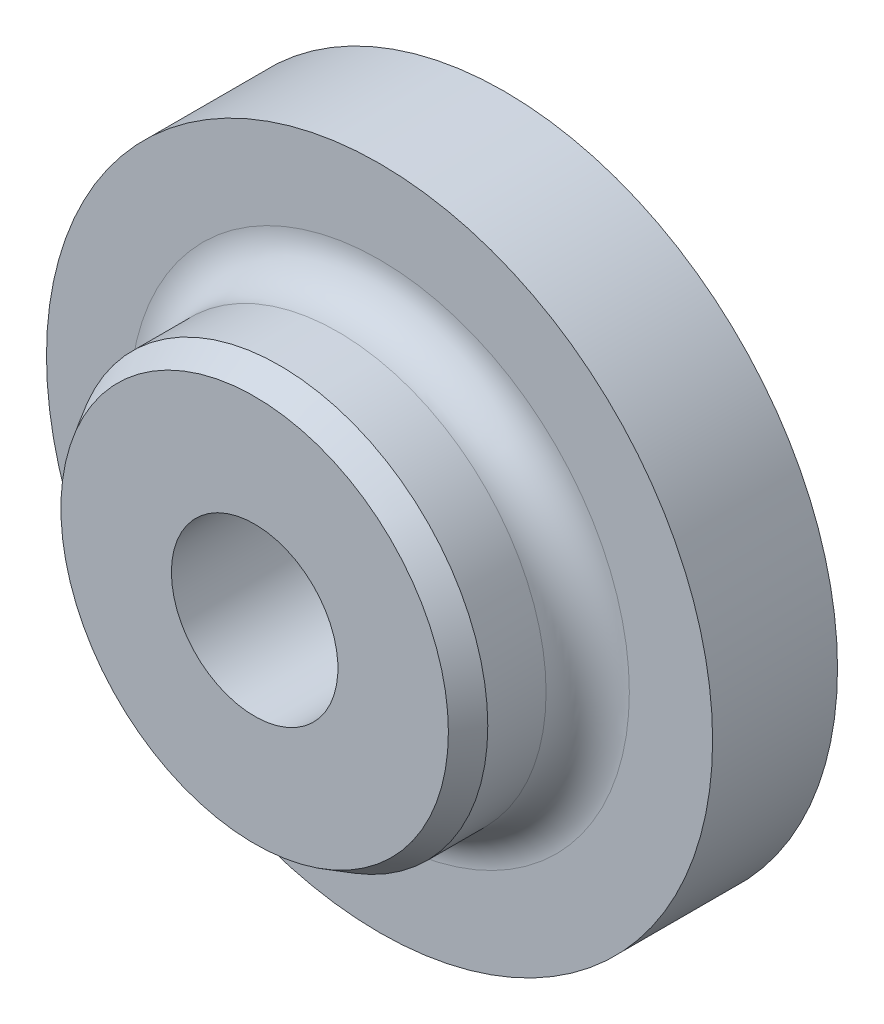
ISO-10303-21;
HEADER;
FILE_DESCRIPTION(('STEP AP214'),'2;1');
FILE_NAME('part.step','',(''),(''),'','','');
FILE_SCHEMA(('AUTOMOTIVE_DESIGN { 1 0 10303 214 1 1 1 1 }'));
ENDSEC;
DATA;
#1=APPLICATION_CONTEXT('core data for automotive mechanical design processes');
#2=APPLICATION_PROTOCOL_DEFINITION('international standard','automotive_design',2000,#1);
#3=PRODUCT_CONTEXT('',#1,'mechanical');
#4=PRODUCT('Part','Part','',(#3));
#5=PRODUCT_RELATED_PRODUCT_CATEGORY('part','',(#4));
#6=PRODUCT_DEFINITION_FORMATION('','',#4);
#7=PRODUCT_DEFINITION_CONTEXT('part definition',#1,'design');
#8=PRODUCT_DEFINITION('design','',#6,#7);
#9=PRODUCT_DEFINITION_SHAPE('','',#8);
#10=(LENGTH_UNIT() NAMED_UNIT(*) SI_UNIT(.MILLI.,.METRE.));
#11=(NAMED_UNIT(*) PLANE_ANGLE_UNIT() SI_UNIT($,.RADIAN.));
#12=(NAMED_UNIT(*) SI_UNIT($,.STERADIAN.) SOLID_ANGLE_UNIT());
#13=UNCERTAINTY_MEASURE_WITH_UNIT(LENGTH_MEASURE(1.E-05),#10,'distance_accuracy_value','');
#14=(GEOMETRIC_REPRESENTATION_CONTEXT(3) GLOBAL_UNCERTAINTY_ASSIGNED_CONTEXT((#13)) GLOBAL_UNIT_ASSIGNED_CONTEXT((#10,
#11,#12)) REPRESENTATION_CONTEXT('',''));
#15=CARTESIAN_POINT('',(0.,0.,0.));
#16=DIRECTION('',(0.,0.,1.));
#17=DIRECTION('',(1.,0.,0.));
#18=AXIS2_PLACEMENT_3D('',#15,#16,#17);
#19=CARTESIAN_POINT('',(0.,0.,1.5));
#20=DIRECTION('',(0.,0.,1.));
#21=DIRECTION('',(-1.,0.,0.));
#22=AXIS2_PLACEMENT_3D('',#19,#20,#21);
#23=CYLINDRICAL_SURFACE('',#22,1.);
#24=CARTESIAN_POINT('',(0.,0.,0.));
#25=DIRECTION('',(0.,0.,-1.));
#26=DIRECTION('',(1.,0.,0.));
#27=AXIS2_PLACEMENT_3D('',#24,#25,#26);
#28=CIRCLE('',#27,1.);
#29=CARTESIAN_POINT('',(1.,0.,0.));
#30=VERTEX_POINT('',#29);
#31=EDGE_CURVE('E51',#30,#30,#28,.F.);
#32=ORIENTED_EDGE('',*,*,#31,.F.);
#33=EDGE_LOOP('',(#32));
#34=FACE_BOUND('',#33,.T.);
#35=CARTESIAN_POINT('',(0.,0.,3.));
#36=DIRECTION('',(0.,0.,1.));
#37=DIRECTION('',(-1.,0.,0.));
#38=AXIS2_PLACEMENT_3D('',#35,#36,#37);
#39=CIRCLE('',#38,1.);
#40=CARTESIAN_POINT('',(-1.,0.,3.));
#41=VERTEX_POINT('',#40);
#42=EDGE_CURVE('E47',#41,#41,#39,.T.);
#43=ORIENTED_EDGE('',*,*,#42,.T.);
#44=EDGE_LOOP('',(#43));
#45=FACE_BOUND('',#44,.T.);
#46=ADVANCED_FACE('F15',(#34,#45),#23,.F.);
#47=CARTESIAN_POINT('',(4.,-4.1070229942,0.));
#48=DIRECTION('',(0.,0.,-1.));
#49=DIRECTION('',(-1.,0.,0.));
#50=AXIS2_PLACEMENT_3D('',#47,#48,#49);
#51=PLANE('',#50);
#52=CARTESIAN_POINT('',(0.,0.,0.));
#53=DIRECTION('',(0.,0.,-1.));
#54=DIRECTION('',(-1.,0.,0.));
#55=AXIS2_PLACEMENT_3D('',#52,#53,#54);
#56=CIRCLE('',#55,4.);
#57=CARTESIAN_POINT('',(-4.,0.,0.));
#58=VERTEX_POINT('',#57);
#59=EDGE_CURVE('E44',#58,#58,#56,.F.);
#60=ORIENTED_EDGE('',*,*,#59,.F.);
#61=EDGE_LOOP('',(#60));
#62=FACE_BOUND('',#61,.T.);
#63=ORIENTED_EDGE('',*,*,#31,.T.);
#64=EDGE_LOOP('',(#63));
#65=FACE_BOUND('',#64,.T.);
#66=ADVANCED_FACE('F55',(#62,#65),#51,.T.);
#67=CARTESIAN_POINT('',(-2.3267949192,-2.389050058985,3.));
#68=DIRECTION('',(0.,0.,1.));
#69=DIRECTION('',(1.,0.,0.));
#70=AXIS2_PLACEMENT_3D('',#67,#68,#69);
#71=PLANE('',#70);
#72=CARTESIAN_POINT('',(0.,0.,3.));
#73=DIRECTION('',(0.,0.,1.));
#74=DIRECTION('',(1.,0.,0.));
#75=AXIS2_PLACEMENT_3D('',#72,#73,#74);
#76=CIRCLE('',#75,2.3267949192);
#77=CARTESIAN_POINT('',(2.3267949192,0.,3.));
#78=VERTEX_POINT('',#77);
#79=EDGE_CURVE('E40',#78,#78,#76,.T.);
#80=ORIENTED_EDGE('',*,*,#79,.T.);
#81=EDGE_LOOP('',(#80));
#82=FACE_BOUND('',#81,.T.);
#83=ORIENTED_EDGE('',*,*,#42,.F.);
#84=EDGE_LOOP('',(#83));
#85=FACE_BOUND('',#84,.T.);
#86=ADVANCED_FACE('F62',(#82,#85),#71,.T.);
#87=CARTESIAN_POINT('',(0.,0.,0.75));
#88=DIRECTION('',(0.,0.,1.));
#89=DIRECTION('',(1.,0.,0.));
#90=AXIS2_PLACEMENT_3D('',#87,#88,#89);
#91=CYLINDRICAL_SURFACE('',#90,4.);
#92=ORIENTED_EDGE('',*,*,#59,.T.);
#93=EDGE_LOOP('',(#92));
#94=FACE_BOUND('',#93,.T.);
#95=CARTESIAN_POINT('',(0.,0.,1.5));
#96=DIRECTION('',(0.,0.,-1.));
#97=DIRECTION('',(-1.,0.,0.));
#98=AXIS2_PLACEMENT_3D('',#95,#96,#97);
#99=CIRCLE('',#98,4.);
#100=CARTESIAN_POINT('',(-4.,0.,1.5));
#101=VERTEX_POINT('',#100);
#102=EDGE_CURVE('E35',#101,#101,#99,.F.);
#103=ORIENTED_EDGE('',*,*,#102,.F.);
#104=EDGE_LOOP('',(#103));
#105=FACE_BOUND('',#104,.T.);
#106=ADVANCED_FACE('F64',(#94,#105),#91,.T.);
#107=CARTESIAN_POINT('',(0.,0.,2.7));
#108=DIRECTION('',(0.,0.,-1.));
#109=DIRECTION('',(-1.,0.,0.));
#110=AXIS2_PLACEMENT_3D('',#107,#108,#109);
#111=CONICAL_SURFACE('',#110,2.5,0.523598775706079);
#112=CARTESIAN_POINT('',(0.,0.,2.7));
#113=DIRECTION('',(0.,0.,1.));
#114=DIRECTION('',(1.,0.,0.));
#115=AXIS2_PLACEMENT_3D('',#112,#113,#114);
#116=CIRCLE('',#115,2.5);
#117=CARTESIAN_POINT('',(2.5,0.,2.7));
#118=VERTEX_POINT('',#117);
#119=EDGE_CURVE('E30',#118,#118,#116,.T.);
#120=ORIENTED_EDGE('',*,*,#119,.T.);
#121=EDGE_LOOP('',(#120));
#122=FACE_BOUND('',#121,.T.);
#123=ORIENTED_EDGE('',*,*,#79,.F.);
#124=EDGE_LOOP('',(#123));
#125=FACE_BOUND('',#124,.T.);
#126=ADVANCED_FACE('F72',(#122,#125),#111,.T.);
#127=CARTESIAN_POINT('',(-4.,-4.1070229942,1.5));
#128=DIRECTION('',(0.,0.,1.));
#129=DIRECTION('',(1.,0.,0.));
#130=AXIS2_PLACEMENT_3D('',#127,#128,#129);
#131=PLANE('',#130);
#132=ORIENTED_EDGE('',*,*,#102,.T.);
#133=EDGE_LOOP('',(#132));
#134=FACE_BOUND('',#133,.T.);
#135=CARTESIAN_POINT('',(0.,0.,1.5));
#136=DIRECTION('',(0.,0.,-1.));
#137=DIRECTION('',(-1.,0.,0.));
#138=AXIS2_PLACEMENT_3D('',#135,#136,#137);
#139=CIRCLE('',#138,3.);
#140=CARTESIAN_POINT('',(-3.,0.,1.5));
#141=VERTEX_POINT('',#140);
#142=EDGE_CURVE('E23',#141,#141,#139,.F.);
#143=ORIENTED_EDGE('',*,*,#142,.F.);
#144=EDGE_LOOP('',(#143));
#145=FACE_BOUND('',#144,.T.);
#146=ADVANCED_FACE('F80',(#134,#145),#131,.T.);
#147=CARTESIAN_POINT('',(0.,0.,2.35));
#148=DIRECTION('',(0.,0.,1.));
#149=DIRECTION('',(1.,0.,0.));
#150=AXIS2_PLACEMENT_3D('',#147,#148,#149);
#151=CYLINDRICAL_SURFACE('',#150,2.5);
#152=CARTESIAN_POINT('',(0.,0.,2.));
#153=DIRECTION('',(0.,0.,1.));
#154=DIRECTION('',(1.,0.,0.));
#155=AXIS2_PLACEMENT_3D('',#152,#153,#154);
#156=CIRCLE('',#155,2.5);
#157=CARTESIAN_POINT('',(2.5,0.,2.));
#158=VERTEX_POINT('',#157);
#159=EDGE_CURVE('E10',#158,#158,#156,.T.);
#160=ORIENTED_EDGE('',*,*,#159,.T.);
#161=EDGE_LOOP('',(#160));
#162=FACE_BOUND('',#161,.T.);
#163=ORIENTED_EDGE('',*,*,#119,.F.);
#164=EDGE_LOOP('',(#163));
#165=FACE_BOUND('',#164,.T.);
#166=ADVANCED_FACE('F83',(#162,#165),#151,.T.);
#167=CARTESIAN_POINT('',(0.,0.,2.));
#168=DIRECTION('',(0.,0.,1.));
#169=DIRECTION('',(1.,0.,0.));
#170=AXIS2_PLACEMENT_3D('',#167,#168,#169);
#171=TOROIDAL_SURFACE('',#170,3.,0.5);
#172=ORIENTED_EDGE('',*,*,#159,.F.);
#173=EDGE_LOOP('',(#172));
#174=FACE_BOUND('',#173,.T.);
#175=ORIENTED_EDGE('',*,*,#142,.T.);
#176=EDGE_LOOP('',(#175));
#177=FACE_BOUND('',#176,.T.);
#178=ADVANCED_FACE('F17',(#174,#177),#171,.F.);
#179=CLOSED_SHELL('',(#46,#66,#86,#106,#126,#146,#166,#178));
#180=MANIFOLD_SOLID_BREP('B1',#179);
#181=ADVANCED_BREP_SHAPE_REPRESENTATION('',(#18,#180),#14);
#182=SHAPE_DEFINITION_REPRESENTATION(#9,#181);
ENDSEC;
END-ISO-10303-21;
